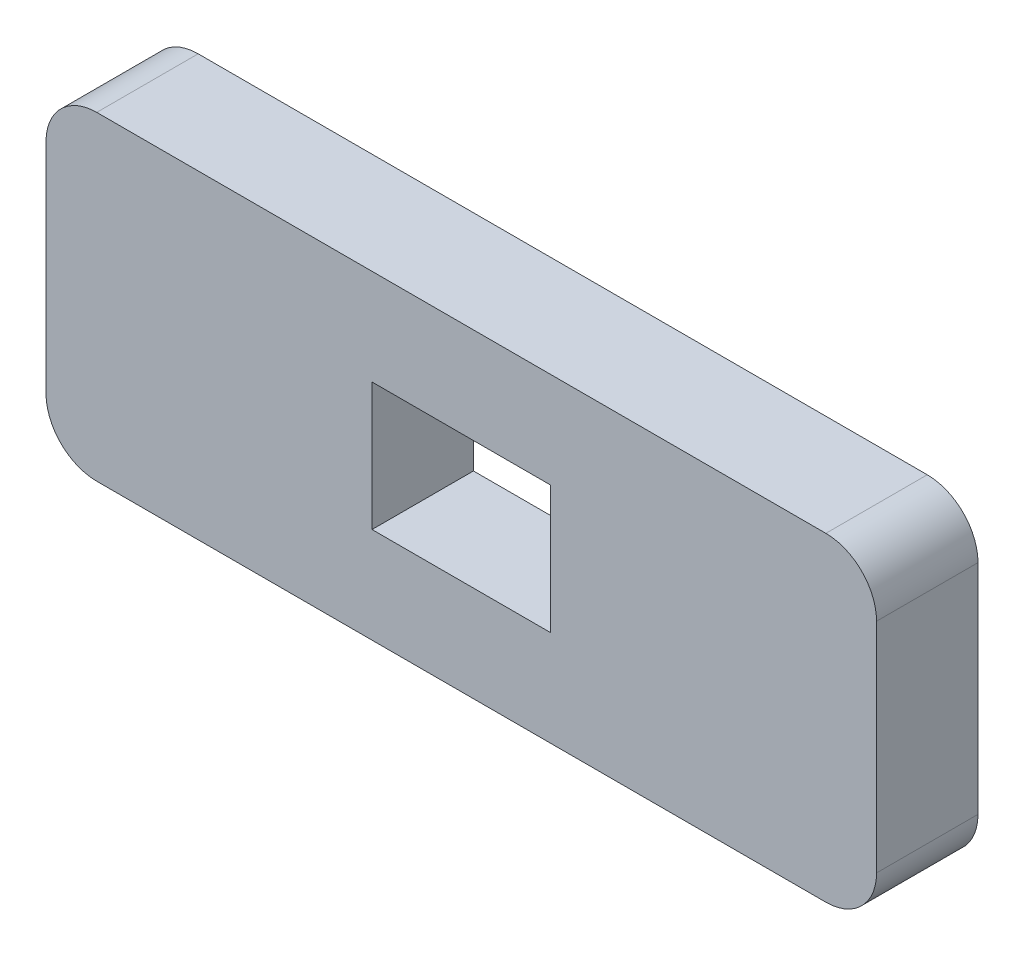
ISO-10303-21;
HEADER;
FILE_DESCRIPTION(('STEP AP214'),'2;1');
FILE_NAME('part.step','',(''),(''),'','','');
FILE_SCHEMA(('AUTOMOTIVE_DESIGN { 1 0 10303 214 1 1 1 1 }'));
ENDSEC;
DATA;
#1=APPLICATION_CONTEXT('core data for automotive mechanical design processes');
#2=APPLICATION_PROTOCOL_DEFINITION('international standard','automotive_design',2000,#1);
#3=PRODUCT_CONTEXT('',#1,'mechanical');
#4=PRODUCT('Part','Part','',(#3));
#5=PRODUCT_RELATED_PRODUCT_CATEGORY('part','',(#4));
#6=PRODUCT_DEFINITION_FORMATION('','',#4);
#7=PRODUCT_DEFINITION_CONTEXT('part definition',#1,'design');
#8=PRODUCT_DEFINITION('design','',#6,#7);
#9=PRODUCT_DEFINITION_SHAPE('','',#8);
#10=(LENGTH_UNIT() NAMED_UNIT(*) SI_UNIT(.MILLI.,.METRE.));
#11=(NAMED_UNIT(*) PLANE_ANGLE_UNIT() SI_UNIT($,.RADIAN.));
#12=(NAMED_UNIT(*) SI_UNIT($,.STERADIAN.) SOLID_ANGLE_UNIT());
#13=UNCERTAINTY_MEASURE_WITH_UNIT(LENGTH_MEASURE(1.E-05),#10,'distance_accuracy_value','');
#14=(GEOMETRIC_REPRESENTATION_CONTEXT(3) GLOBAL_UNCERTAINTY_ASSIGNED_CONTEXT((#13)) GLOBAL_UNIT_ASSIGNED_CONTEXT((#10,
#11,#12)) REPRESENTATION_CONTEXT('',''));
#15=CARTESIAN_POINT('',(0.,0.,0.));
#16=DIRECTION('',(0.,0.,1.));
#17=DIRECTION('',(1.,0.,0.));
#18=AXIS2_PLACEMENT_3D('',#15,#16,#17);
#19=CARTESIAN_POINT('',(5.706,1.706,1.5875));
#20=DIRECTION('',(0.,0.,-1.));
#21=DIRECTION('',(-1.,0.,0.));
#22=AXIS2_PLACEMENT_3D('',#19,#20,#21);
#23=CYLINDRICAL_SURFACE('',#22,0.794);
#24=CARTESIAN_POINT('',(5.706,1.706,0.));
#25=DIRECTION('',(0.,0.,1.));
#26=DIRECTION('',(-1.,0.,0.));
#27=AXIS2_PLACEMENT_3D('',#24,#25,#26);
#28=CIRCLE('',#27,0.794);
#29=CARTESIAN_POINT('',(6.5,1.70599999999999,0.));
#30=VERTEX_POINT('',#29);
#31=CARTESIAN_POINT('',(5.70599999999999,2.5,0.));
#32=VERTEX_POINT('',#31);
#33=EDGE_CURVE('E175',#30,#32,#28,.T.);
#34=ORIENTED_EDGE('',*,*,#33,.T.);
#35=DIRECTION('',(0.,0.,-1.));
#36=VECTOR('',#35,1.);
#37=CARTESIAN_POINT('',(5.70599999999999,2.5,1.5875));
#38=LINE('',#37,#36);
#39=CARTESIAN_POINT('',(5.70599999999999,2.5,1.5875));
#40=VERTEX_POINT('',#39);
#41=EDGE_CURVE('E11',#40,#32,#38,.T.);
#42=ORIENTED_EDGE('',*,*,#41,.F.);
#43=CARTESIAN_POINT('',(5.706,1.706,1.5875));
#44=DIRECTION('',(0.,0.,1.));
#45=DIRECTION('',(-1.,0.,0.));
#46=AXIS2_PLACEMENT_3D('',#43,#44,#45);
#47=CIRCLE('',#46,0.794);
#48=CARTESIAN_POINT('',(6.5,1.70599999999999,1.5875));
#49=VERTEX_POINT('',#48);
#50=EDGE_CURVE('E181',#49,#40,#47,.T.);
#51=ORIENTED_EDGE('',*,*,#50,.F.);
#52=DIRECTION('',(0.,0.,-1.));
#53=VECTOR('',#52,1.);
#54=CARTESIAN_POINT('',(6.5,1.70599999999999,1.5875));
#55=LINE('',#54,#53);
#56=EDGE_CURVE('E207',#49,#30,#55,.T.);
#57=ORIENTED_EDGE('',*,*,#56,.T.);
#58=EDGE_LOOP('',(#34,#42,#51,#57));
#59=FACE_BOUND('',#58,.T.);
#60=ADVANCED_FACE('F43',(#59),#23,.T.);
#61=CARTESIAN_POINT('',(-5.706,2.5,1.5875));
#62=DIRECTION('',(0.,-1.,0.));
#63=DIRECTION('',(1.,0.,0.));
#64=AXIS2_PLACEMENT_3D('',#61,#62,#63);
#65=PLANE('',#64);
#66=DIRECTION('',(-1.,0.,0.));
#67=VECTOR('',#66,1.);
#68=CARTESIAN_POINT('',(-5.706,2.5,0.));
#69=LINE('',#68,#67);
#70=CARTESIAN_POINT('',(-5.706,2.5,0.));
#71=VERTEX_POINT('',#70);
#72=EDGE_CURVE('E211',#32,#71,#69,.T.);
#73=ORIENTED_EDGE('',*,*,#72,.T.);
#74=DIRECTION('',(0.,0.,-1.));
#75=VECTOR('',#74,1.);
#76=CARTESIAN_POINT('',(-5.706,2.5,1.5875));
#77=LINE('',#76,#75);
#78=CARTESIAN_POINT('',(-5.706,2.5,1.5875));
#79=VERTEX_POINT('',#78);
#80=EDGE_CURVE('E51',#79,#71,#77,.T.);
#81=ORIENTED_EDGE('',*,*,#80,.F.);
#82=DIRECTION('',(-1.,0.,0.));
#83=VECTOR('',#82,1.);
#84=CARTESIAN_POINT('',(-5.706,2.5,1.5875));
#85=LINE('',#84,#83);
#86=EDGE_CURVE('E185',#40,#79,#85,.T.);
#87=ORIENTED_EDGE('',*,*,#86,.F.);
#88=ORIENTED_EDGE('',*,*,#41,.T.);
#89=EDGE_LOOP('',(#73,#81,#87,#88));
#90=FACE_BOUND('',#89,.T.);
#91=ADVANCED_FACE('F280',(#90),#65,.F.);
#92=CARTESIAN_POINT('',(-5.706,1.706,1.5875));
#93=DIRECTION('',(0.,0.,-1.));
#94=DIRECTION('',(-1.,0.,0.));
#95=AXIS2_PLACEMENT_3D('',#92,#93,#94);
#96=CYLINDRICAL_SURFACE('',#95,0.794);
#97=CARTESIAN_POINT('',(-5.706,1.706,0.));
#98=DIRECTION('',(0.,0.,1.));
#99=DIRECTION('',(-1.,0.,0.));
#100=AXIS2_PLACEMENT_3D('',#97,#98,#99);
#101=CIRCLE('',#100,0.794);
#102=CARTESIAN_POINT('',(-6.5,1.70599999999999,0.));
#103=VERTEX_POINT('',#102);
#104=EDGE_CURVE('E214',#71,#103,#101,.T.);
#105=ORIENTED_EDGE('',*,*,#104,.T.);
#106=DIRECTION('',(0.,0.,-1.));
#107=VECTOR('',#106,1.);
#108=CARTESIAN_POINT('',(-6.5,1.70599999999999,1.5875));
#109=LINE('',#108,#107);
#110=CARTESIAN_POINT('',(-6.5,1.70599999999999,1.5875));
#111=VERTEX_POINT('',#110);
#112=EDGE_CURVE('E250',#111,#103,#109,.T.);
#113=ORIENTED_EDGE('',*,*,#112,.F.);
#114=CARTESIAN_POINT('',(-5.706,1.706,1.5875));
#115=DIRECTION('',(0.,0.,1.));
#116=DIRECTION('',(-1.,0.,0.));
#117=AXIS2_PLACEMENT_3D('',#114,#115,#116);
#118=CIRCLE('',#117,0.794);
#119=EDGE_CURVE('E189',#79,#111,#118,.T.);
#120=ORIENTED_EDGE('',*,*,#119,.F.);
#121=ORIENTED_EDGE('',*,*,#80,.T.);
#122=EDGE_LOOP('',(#105,#113,#120,#121));
#123=FACE_BOUND('',#122,.T.);
#124=ADVANCED_FACE('F259',(#123),#96,.T.);
#125=CARTESIAN_POINT('',(-6.5,-1.706,1.5875));
#126=DIRECTION('',(1.,0.,0.));
#127=DIRECTION('',(0.,1.,0.));
#128=AXIS2_PLACEMENT_3D('',#125,#126,#127);
#129=PLANE('',#128);
#130=DIRECTION('',(0.,-1.,0.));
#131=VECTOR('',#130,1.);
#132=CARTESIAN_POINT('',(-6.5,-1.706,0.));
#133=LINE('',#132,#131);
#134=CARTESIAN_POINT('',(-6.5,-1.706,0.));
#135=VERTEX_POINT('',#134);
#136=EDGE_CURVE('E217',#103,#135,#133,.T.);
#137=ORIENTED_EDGE('',*,*,#136,.T.);
#138=DIRECTION('',(0.,0.,-1.));
#139=VECTOR('',#138,1.);
#140=CARTESIAN_POINT('',(-6.5,-1.706,1.5875));
#141=LINE('',#140,#139);
#142=CARTESIAN_POINT('',(-6.5,-1.706,1.5875));
#143=VERTEX_POINT('',#142);
#144=EDGE_CURVE('E246',#143,#135,#141,.T.);
#145=ORIENTED_EDGE('',*,*,#144,.F.);
#146=DIRECTION('',(0.,-1.,0.));
#147=VECTOR('',#146,1.);
#148=CARTESIAN_POINT('',(-6.5,-1.706,1.5875));
#149=LINE('',#148,#147);
#150=EDGE_CURVE('E192',#111,#143,#149,.T.);
#151=ORIENTED_EDGE('',*,*,#150,.F.);
#152=ORIENTED_EDGE('',*,*,#112,.T.);
#153=EDGE_LOOP('',(#137,#145,#151,#152));
#154=FACE_BOUND('',#153,.T.);
#155=ADVANCED_FACE('F268',(#154),#129,.F.);
#156=CARTESIAN_POINT('',(-5.706,-1.706,1.5875));
#157=DIRECTION('',(0.,0.,-1.));
#158=DIRECTION('',(-1.,0.,0.));
#159=AXIS2_PLACEMENT_3D('',#156,#157,#158);
#160=CYLINDRICAL_SURFACE('',#159,0.794);
#161=CARTESIAN_POINT('',(-5.706,-1.706,0.));
#162=DIRECTION('',(0.,0.,1.));
#163=DIRECTION('',(-1.,0.,0.));
#164=AXIS2_PLACEMENT_3D('',#161,#162,#163);
#165=CIRCLE('',#164,0.794);
#166=CARTESIAN_POINT('',(-5.70599999999999,-2.5,0.));
#167=VERTEX_POINT('',#166);
#168=EDGE_CURVE('E220',#135,#167,#165,.T.);
#169=ORIENTED_EDGE('',*,*,#168,.T.);
#170=DIRECTION('',(0.,0.,-1.));
#171=VECTOR('',#170,1.);
#172=CARTESIAN_POINT('',(-5.70599999999999,-2.5,1.5875));
#173=LINE('',#172,#171);
#174=CARTESIAN_POINT('',(-5.70599999999999,-2.5,1.5875));
#175=VERTEX_POINT('',#174);
#176=EDGE_CURVE('E242',#175,#167,#173,.T.);
#177=ORIENTED_EDGE('',*,*,#176,.F.);
#178=CARTESIAN_POINT('',(-5.706,-1.706,1.5875));
#179=DIRECTION('',(0.,0.,1.));
#180=DIRECTION('',(-1.,0.,0.));
#181=AXIS2_PLACEMENT_3D('',#178,#179,#180);
#182=CIRCLE('',#181,0.794);
#183=EDGE_CURVE('E195',#143,#175,#182,.T.);
#184=ORIENTED_EDGE('',*,*,#183,.F.);
#185=ORIENTED_EDGE('',*,*,#144,.T.);
#186=EDGE_LOOP('',(#169,#177,#184,#185));
#187=FACE_BOUND('',#186,.T.);
#188=ADVANCED_FACE('F272',(#187),#160,.T.);
#189=CARTESIAN_POINT('',(-5.70599999999999,-2.5,1.5875));
#190=DIRECTION('',(0.,1.,0.));
#191=DIRECTION('',(-1.,0.,0.));
#192=AXIS2_PLACEMENT_3D('',#189,#190,#191);
#193=PLANE('',#192);
#194=DIRECTION('',(1.,0.,0.));
#195=VECTOR('',#194,1.);
#196=CARTESIAN_POINT('',(-5.70599999999999,-2.5,0.));
#197=LINE('',#196,#195);
#198=CARTESIAN_POINT('',(5.70599999999999,-2.5,0.));
#199=VERTEX_POINT('',#198);
#200=EDGE_CURVE('E223',#167,#199,#197,.T.);
#201=ORIENTED_EDGE('',*,*,#200,.T.);
#202=DIRECTION('',(0.,0.,-1.));
#203=VECTOR('',#202,1.);
#204=CARTESIAN_POINT('',(5.70599999999999,-2.5,1.5875));
#205=LINE('',#204,#203);
#206=CARTESIAN_POINT('',(5.70599999999999,-2.5,1.5875));
#207=VERTEX_POINT('',#206);
#208=EDGE_CURVE('E238',#207,#199,#205,.T.);
#209=ORIENTED_EDGE('',*,*,#208,.F.);
#210=DIRECTION('',(1.,0.,0.));
#211=VECTOR('',#210,1.);
#212=CARTESIAN_POINT('',(-5.70599999999999,-2.5,1.5875));
#213=LINE('',#212,#211);
#214=EDGE_CURVE('E198',#175,#207,#213,.T.);
#215=ORIENTED_EDGE('',*,*,#214,.F.);
#216=ORIENTED_EDGE('',*,*,#176,.T.);
#217=EDGE_LOOP('',(#201,#209,#215,#216));
#218=FACE_BOUND('',#217,.T.);
#219=ADVANCED_FACE('F293',(#218),#193,.F.);
#220=CARTESIAN_POINT('',(5.706,-1.706,1.5875));
#221=DIRECTION('',(0.,0.,-1.));
#222=DIRECTION('',(-1.,0.,0.));
#223=AXIS2_PLACEMENT_3D('',#220,#221,#222);
#224=CYLINDRICAL_SURFACE('',#223,0.794);
#225=CARTESIAN_POINT('',(5.706,-1.706,0.));
#226=DIRECTION('',(0.,0.,1.));
#227=DIRECTION('',(1.,0.,0.));
#228=AXIS2_PLACEMENT_3D('',#225,#226,#227);
#229=CIRCLE('',#228,0.794);
#230=CARTESIAN_POINT('',(6.5,-1.706,0.));
#231=VERTEX_POINT('',#230);
#232=EDGE_CURVE('E226',#199,#231,#229,.T.);
#233=ORIENTED_EDGE('',*,*,#232,.T.);
#234=DIRECTION('',(0.,0.,-1.));
#235=VECTOR('',#234,1.);
#236=CARTESIAN_POINT('',(6.5,-1.706,1.5875));
#237=LINE('',#236,#235);
#238=CARTESIAN_POINT('',(6.5,-1.706,1.5875));
#239=VERTEX_POINT('',#238);
#240=EDGE_CURVE('E234',#239,#231,#237,.T.);
#241=ORIENTED_EDGE('',*,*,#240,.F.);
#242=CARTESIAN_POINT('',(5.706,-1.706,1.5875));
#243=DIRECTION('',(0.,0.,1.));
#244=DIRECTION('',(1.,0.,0.));
#245=AXIS2_PLACEMENT_3D('',#242,#243,#244);
#246=CIRCLE('',#245,0.794);
#247=EDGE_CURVE('E201',#207,#239,#246,.T.);
#248=ORIENTED_EDGE('',*,*,#247,.F.);
#249=ORIENTED_EDGE('',*,*,#208,.T.);
#250=EDGE_LOOP('',(#233,#241,#248,#249));
#251=FACE_BOUND('',#250,.T.);
#252=ADVANCED_FACE('F291',(#251),#224,.T.);
#253=CARTESIAN_POINT('',(6.5,-1.70599999999999,1.5875));
#254=DIRECTION('',(-1.,0.,0.));
#255=DIRECTION('',(0.,-1.,0.));
#256=AXIS2_PLACEMENT_3D('',#253,#254,#255);
#257=PLANE('',#256);
#258=DIRECTION('',(0.,1.,0.));
#259=VECTOR('',#258,1.);
#260=CARTESIAN_POINT('',(6.5,-1.70599999999999,0.));
#261=LINE('',#260,#259);
#262=EDGE_CURVE('E186',#231,#30,#261,.T.);
#263=ORIENTED_EDGE('',*,*,#262,.T.);
#264=ORIENTED_EDGE('',*,*,#56,.F.);
#265=DIRECTION('',(0.,1.,0.));
#266=VECTOR('',#265,1.);
#267=CARTESIAN_POINT('',(6.5,-1.70599999999999,1.5875));
#268=LINE('',#267,#266);
#269=EDGE_CURVE('E204',#239,#49,#268,.T.);
#270=ORIENTED_EDGE('',*,*,#269,.F.);
#271=ORIENTED_EDGE('',*,*,#240,.T.);
#272=EDGE_LOOP('',(#263,#264,#270,#271));
#273=FACE_BOUND('',#272,.T.);
#274=ADVANCED_FACE('F286',(#273),#257,.F.);
#275=CARTESIAN_POINT('',(5.706,1.706,1.5875));
#276=DIRECTION('',(0.,0.,-1.));
#277=DIRECTION('',(-1.,0.,0.));
#278=AXIS2_PLACEMENT_3D('',#275,#276,#277);
#279=PLANE('',#278);
#280=DIRECTION('',(1.,0.,0.));
#281=VECTOR('',#280,1.);
#282=CARTESIAN_POINT('',(-1.397,-1.,1.5875));
#283=LINE('',#282,#281);
#284=CARTESIAN_POINT('',(-1.397,-1.,1.5875));
#285=VERTEX_POINT('',#284);
#286=CARTESIAN_POINT('',(1.397,-1.,1.5875));
#287=VERTEX_POINT('',#286);
#288=EDGE_CURVE('E166',#285,#287,#283,.T.);
#289=ORIENTED_EDGE('',*,*,#288,.F.);
#290=DIRECTION('',(0.,-1.,0.));
#291=VECTOR('',#290,1.);
#292=CARTESIAN_POINT('',(-1.397,-1.,1.5875));
#293=LINE('',#292,#291);
#294=CARTESIAN_POINT('',(-1.397,1.,1.5875));
#295=VERTEX_POINT('',#294);
#296=EDGE_CURVE('E58',#295,#285,#293,.T.);
#297=ORIENTED_EDGE('',*,*,#296,.F.);
#298=DIRECTION('',(-1.,0.,0.));
#299=VECTOR('',#298,1.);
#300=CARTESIAN_POINT('',(-1.397,1.,1.5875));
#301=LINE('',#300,#299);
#302=CARTESIAN_POINT('',(1.397,1.,1.5875));
#303=VERTEX_POINT('',#302);
#304=EDGE_CURVE('E153',#303,#295,#301,.T.);
#305=ORIENTED_EDGE('',*,*,#304,.F.);
#306=DIRECTION('',(0.,1.,0.));
#307=VECTOR('',#306,1.);
#308=CARTESIAN_POINT('',(1.397,-1.,1.5875));
#309=LINE('',#308,#307);
#310=EDGE_CURVE('E157',#287,#303,#309,.T.);
#311=ORIENTED_EDGE('',*,*,#310,.F.);
#312=EDGE_LOOP('',(#289,#297,#305,#311));
#313=FACE_BOUND('',#312,.T.);
#314=ORIENTED_EDGE('',*,*,#50,.T.);
#315=ORIENTED_EDGE('',*,*,#86,.T.);
#316=ORIENTED_EDGE('',*,*,#119,.T.);
#317=ORIENTED_EDGE('',*,*,#150,.T.);
#318=ORIENTED_EDGE('',*,*,#183,.T.);
#319=ORIENTED_EDGE('',*,*,#214,.T.);
#320=ORIENTED_EDGE('',*,*,#247,.T.);
#321=ORIENTED_EDGE('',*,*,#269,.T.);
#322=EDGE_LOOP('',(#314,#315,#316,#317,#318,#319,#320,#321));
#323=FACE_BOUND('',#322,.T.);
#324=ADVANCED_FACE('F276',(#313,#323),#279,.F.);
#325=CARTESIAN_POINT('',(5.706,1.706,0.));
#326=DIRECTION('',(0.,0.,-1.));
#327=DIRECTION('',(-1.,0.,0.));
#328=AXIS2_PLACEMENT_3D('',#325,#326,#327);
#329=PLANE('',#328);
#330=DIRECTION('',(0.,-1.,0.));
#331=VECTOR('',#330,1.);
#332=CARTESIAN_POINT('',(-1.397,-1.,0.));
#333=LINE('',#332,#331);
#334=CARTESIAN_POINT('',(-1.397,1.,0.));
#335=VERTEX_POINT('',#334);
#336=CARTESIAN_POINT('',(-1.397,-1.,0.));
#337=VERTEX_POINT('',#336);
#338=EDGE_CURVE('E134',#335,#337,#333,.T.);
#339=ORIENTED_EDGE('',*,*,#338,.T.);
#340=DIRECTION('',(1.,0.,0.));
#341=VECTOR('',#340,1.);
#342=CARTESIAN_POINT('',(-1.397,-1.,0.));
#343=LINE('',#342,#341);
#344=CARTESIAN_POINT('',(1.397,-1.,0.));
#345=VERTEX_POINT('',#344);
#346=EDGE_CURVE('E144',#337,#345,#343,.T.);
#347=ORIENTED_EDGE('',*,*,#346,.T.);
#348=DIRECTION('',(0.,1.,0.));
#349=VECTOR('',#348,1.);
#350=CARTESIAN_POINT('',(1.397,-1.,0.));
#351=LINE('',#350,#349);
#352=CARTESIAN_POINT('',(1.397,1.,0.));
#353=VERTEX_POINT('',#352);
#354=EDGE_CURVE('E66',#345,#353,#351,.T.);
#355=ORIENTED_EDGE('',*,*,#354,.T.);
#356=DIRECTION('',(-1.,0.,0.));
#357=VECTOR('',#356,1.);
#358=CARTESIAN_POINT('',(-1.397,1.,0.));
#359=LINE('',#358,#357);
#360=EDGE_CURVE('E141',#353,#335,#359,.T.);
#361=ORIENTED_EDGE('',*,*,#360,.T.);
#362=EDGE_LOOP('',(#339,#347,#355,#361));
#363=FACE_BOUND('',#362,.T.);
#364=ORIENTED_EDGE('',*,*,#33,.F.);
#365=ORIENTED_EDGE('',*,*,#262,.F.);
#366=ORIENTED_EDGE('',*,*,#232,.F.);
#367=ORIENTED_EDGE('',*,*,#200,.F.);
#368=ORIENTED_EDGE('',*,*,#168,.F.);
#369=ORIENTED_EDGE('',*,*,#136,.F.);
#370=ORIENTED_EDGE('',*,*,#104,.F.);
#371=ORIENTED_EDGE('',*,*,#72,.F.);
#372=EDGE_LOOP('',(#364,#365,#366,#367,#368,#369,#370,#371));
#373=FACE_BOUND('',#372,.T.);
#374=ADVANCED_FACE('F149',(#363,#373),#329,.T.);
#375=CARTESIAN_POINT('',(-1.397,-1.,0.));
#376=DIRECTION('',(-1.,0.,0.));
#377=DIRECTION('',(0.,0.,1.));
#378=AXIS2_PLACEMENT_3D('',#375,#376,#377);
#379=PLANE('',#378);
#380=ORIENTED_EDGE('',*,*,#296,.T.);
#381=DIRECTION('',(0.,0.,1.));
#382=VECTOR('',#381,1.);
#383=CARTESIAN_POINT('',(-1.397,-1.,0.));
#384=LINE('',#383,#382);
#385=EDGE_CURVE('E130',#337,#285,#384,.T.);
#386=ORIENTED_EDGE('',*,*,#385,.F.);
#387=ORIENTED_EDGE('',*,*,#338,.F.);
#388=DIRECTION('',(0.,0.,1.));
#389=VECTOR('',#388,1.);
#390=CARTESIAN_POINT('',(-1.397,1.,0.));
#391=LINE('',#390,#389);
#392=EDGE_CURVE('E172',#335,#295,#391,.T.);
#393=ORIENTED_EDGE('',*,*,#392,.T.);
#394=EDGE_LOOP('',(#380,#386,#387,#393));
#395=FACE_BOUND('',#394,.T.);
#396=ADVANCED_FACE('F132',(#395),#379,.F.);
#397=CARTESIAN_POINT('',(-1.397,1.,0.));
#398=DIRECTION('',(0.,1.,0.));
#399=DIRECTION('',(0.,0.,1.));
#400=AXIS2_PLACEMENT_3D('',#397,#398,#399);
#401=PLANE('',#400);
#402=ORIENTED_EDGE('',*,*,#304,.T.);
#403=ORIENTED_EDGE('',*,*,#392,.F.);
#404=ORIENTED_EDGE('',*,*,#360,.F.);
#405=DIRECTION('',(0.,0.,1.));
#406=VECTOR('',#405,1.);
#407=CARTESIAN_POINT('',(1.397,1.,0.));
#408=LINE('',#407,#406);
#409=EDGE_CURVE('E176',#353,#303,#408,.T.);
#410=ORIENTED_EDGE('',*,*,#409,.T.);
#411=EDGE_LOOP('',(#402,#403,#404,#410));
#412=FACE_BOUND('',#411,.T.);
#413=ADVANCED_FACE('F364',(#412),#401,.F.);
#414=CARTESIAN_POINT('',(1.397,-1.,0.));
#415=DIRECTION('',(1.,0.,0.));
#416=DIRECTION('',(0.,0.,-1.));
#417=AXIS2_PLACEMENT_3D('',#414,#415,#416);
#418=PLANE('',#417);
#419=ORIENTED_EDGE('',*,*,#310,.T.);
#420=ORIENTED_EDGE('',*,*,#409,.F.);
#421=ORIENTED_EDGE('',*,*,#354,.F.);
#422=DIRECTION('',(0.,0.,1.));
#423=VECTOR('',#422,1.);
#424=CARTESIAN_POINT('',(1.397,-1.,0.));
#425=LINE('',#424,#423);
#426=EDGE_CURVE('E140',#345,#287,#425,.T.);
#427=ORIENTED_EDGE('',*,*,#426,.T.);
#428=EDGE_LOOP('',(#419,#420,#421,#427));
#429=FACE_BOUND('',#428,.T.);
#430=ADVANCED_FACE('F374',(#429),#418,.F.);
#431=CARTESIAN_POINT('',(-1.397,-1.,0.));
#432=DIRECTION('',(0.,-1.,0.));
#433=DIRECTION('',(0.,0.,-1.));
#434=AXIS2_PLACEMENT_3D('',#431,#432,#433);
#435=PLANE('',#434);
#436=ORIENTED_EDGE('',*,*,#288,.T.);
#437=ORIENTED_EDGE('',*,*,#426,.F.);
#438=ORIENTED_EDGE('',*,*,#346,.F.);
#439=ORIENTED_EDGE('',*,*,#385,.T.);
#440=EDGE_LOOP('',(#436,#437,#438,#439));
#441=FACE_BOUND('',#440,.T.);
#442=ADVANCED_FACE('F145',(#441),#435,.F.);
#443=CLOSED_SHELL('',(#60,#91,#124,#155,#188,#219,#252,#274,#324,#374,#396,#413,#430,#442));
#444=MANIFOLD_SOLID_BREP('B2',#443);
#445=ADVANCED_BREP_SHAPE_REPRESENTATION('',(#18,#444),#14);
#446=SHAPE_DEFINITION_REPRESENTATION(#9,#445);
ENDSEC;
END-ISO-10303-21;
